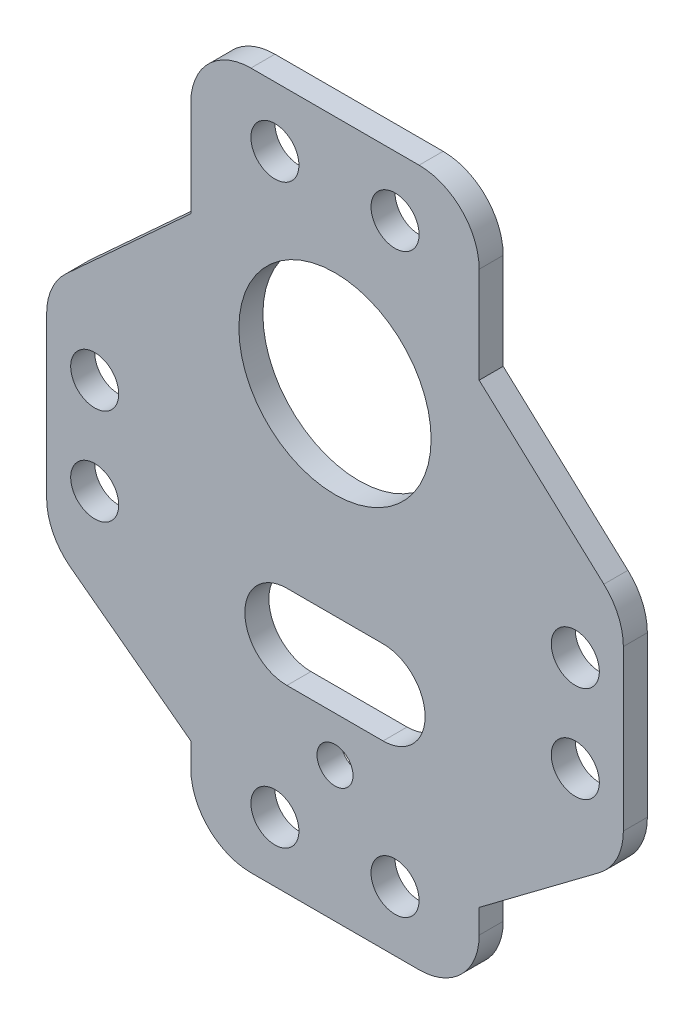
ISO-10303-21;
HEADER;
FILE_DESCRIPTION(('STEP AP214'),'2;1');
FILE_NAME('part.step','',(''),(''),'','','');
FILE_SCHEMA(('AUTOMOTIVE_DESIGN { 1 0 10303 214 1 1 1 1 }'));
ENDSEC;
DATA;
#1=APPLICATION_CONTEXT('core data for automotive mechanical design processes');
#2=APPLICATION_PROTOCOL_DEFINITION('international standard','automotive_design',2000,#1);
#3=PRODUCT_CONTEXT('',#1,'mechanical');
#4=PRODUCT('Part','Part','',(#3));
#5=PRODUCT_RELATED_PRODUCT_CATEGORY('part','',(#4));
#6=PRODUCT_DEFINITION_FORMATION('','',#4);
#7=PRODUCT_DEFINITION_CONTEXT('part definition',#1,'design');
#8=PRODUCT_DEFINITION('design','',#6,#7);
#9=PRODUCT_DEFINITION_SHAPE('','',#8);
#10=(LENGTH_UNIT() NAMED_UNIT(*) SI_UNIT(.MILLI.,.METRE.));
#11=(NAMED_UNIT(*) PLANE_ANGLE_UNIT() SI_UNIT($,.RADIAN.));
#12=(NAMED_UNIT(*) SI_UNIT($,.STERADIAN.) SOLID_ANGLE_UNIT());
#13=UNCERTAINTY_MEASURE_WITH_UNIT(LENGTH_MEASURE(1.E-05),#10,'distance_accuracy_value','');
#14=(GEOMETRIC_REPRESENTATION_CONTEXT(3) GLOBAL_UNCERTAINTY_ASSIGNED_CONTEXT((#13)) GLOBAL_UNIT_ASSIGNED_CONTEXT((#10,
#11,#12)) REPRESENTATION_CONTEXT('',''));
#15=CARTESIAN_POINT('',(0.,0.,0.));
#16=DIRECTION('',(0.,0.,1.));
#17=DIRECTION('',(1.,0.,0.));
#18=AXIS2_PLACEMENT_3D('',#15,#16,#17);
#19=CARTESIAN_POINT('',(0.,0.,2.));
#20=DIRECTION('',(0.,0.,-1.));
#21=DIRECTION('',(-1.,0.,0.));
#22=AXIS2_PLACEMENT_3D('',#19,#20,#21);
#23=PLANE('',#22);
#24=CARTESIAN_POINT('',(8.00000000000001,-65.75,2.));
#25=DIRECTION('',(0.,0.,-1.));
#26=DIRECTION('',(-1.,0.,0.));
#27=AXIS2_PLACEMENT_3D('',#24,#25,#26);
#28=CIRCLE('',#27,1.5);
#29=CARTESIAN_POINT('',(6.50000000000001,-65.75,2.));
#30=VERTEX_POINT('',#29);
#31=EDGE_CURVE('E331',#30,#30,#28,.T.);
#32=ORIENTED_EDGE('',*,*,#31,.T.);
#33=EDGE_LOOP('',(#32));
#34=FACE_BOUND('',#33,.T.);
#35=CARTESIAN_POINT('',(13.,-24.,2.));
#36=DIRECTION('',(0.,0.,-1.));
#37=DIRECTION('',(-1.,0.,0.));
#38=AXIS2_PLACEMENT_3D('',#35,#36,#37);
#39=CIRCLE('',#38,2.);
#40=CARTESIAN_POINT('',(11.,-24.,2.));
#41=VERTEX_POINT('',#40);
#42=EDGE_CURVE('E334',#41,#41,#39,.T.);
#43=ORIENTED_EDGE('',*,*,#42,.T.);
#44=EDGE_LOOP('',(#43));
#45=FACE_BOUND('',#44,.T.);
#46=CARTESIAN_POINT('',(-12.,-56.,2.));
#47=DIRECTION('',(0.,0.,-1.));
#48=DIRECTION('',(-1.,0.,0.));
#49=AXIS2_PLACEMENT_3D('',#46,#47,#48);
#50=CIRCLE('',#49,2.);
#51=CARTESIAN_POINT('',(-14.,-56.,2.));
#52=VERTEX_POINT('',#51);
#53=EDGE_CURVE('E337',#52,#52,#50,.T.);
#54=ORIENTED_EDGE('',*,*,#53,.T.);
#55=EDGE_LOOP('',(#54));
#56=FACE_BOUND('',#55,.T.);
#57=CARTESIAN_POINT('',(13.,-72.,2.));
#58=DIRECTION('',(0.,0.,-1.));
#59=DIRECTION('',(-1.,0.,0.));
#60=AXIS2_PLACEMENT_3D('',#57,#58,#59);
#61=CIRCLE('',#60,2.);
#62=CARTESIAN_POINT('',(11.,-72.,2.));
#63=VERTEX_POINT('',#62);
#64=EDGE_CURVE('E340',#63,#63,#61,.T.);
#65=ORIENTED_EDGE('',*,*,#64,.T.);
#66=EDGE_LOOP('',(#65));
#67=FACE_BOUND('',#66,.T.);
#68=CARTESIAN_POINT('',(8.00000000000001,-38.25,2.));
#69=DIRECTION('',(0.,0.,-1.));
#70=DIRECTION('',(-1.,0.,0.));
#71=AXIS2_PLACEMENT_3D('',#68,#69,#70);
#72=CIRCLE('',#71,8.);
#73=CARTESIAN_POINT('',(0.,-38.25,2.));
#74=VERTEX_POINT('',#73);
#75=EDGE_CURVE('E343',#74,#74,#72,.T.);
#76=ORIENTED_EDGE('',*,*,#75,.T.);
#77=EDGE_LOOP('',(#76));
#78=FACE_BOUND('',#77,.T.);
#79=CARTESIAN_POINT('',(27.,-58.5,2.));
#80=DIRECTION('',(0.,0.,-1.));
#81=DIRECTION('',(-1.,0.,0.));
#82=AXIS2_PLACEMENT_3D('',#79,#80,#81);
#83=CIRCLE('',#82,5.);
#84=CARTESIAN_POINT('',(32.,-58.5,2.));
#85=VERTEX_POINT('',#84);
#86=CARTESIAN_POINT('',(30.,-62.5,2.));
#87=VERTEX_POINT('',#86);
#88=EDGE_CURVE('E203',#85,#87,#83,.T.);
#89=ORIENTED_EDGE('',*,*,#88,.F.);
#90=DIRECTION('',(0.,1.,0.));
#91=VECTOR('',#90,1.);
#92=CARTESIAN_POINT('',(32.,-43.,2.));
#93=LINE('',#92,#91);
#94=CARTESIAN_POINT('',(32.,-45.1995085817082,2.));
#95=VERTEX_POINT('',#94);
#96=EDGE_CURVE('E200',#95,#85,#93,.F.);
#97=ORIENTED_EDGE('',*,*,#96,.F.);
#98=CARTESIAN_POINT('',(27.,-45.1995085817082,2.));
#99=DIRECTION('',(0.,0.,1.));
#100=DIRECTION('',(1.,0.,0.));
#101=AXIS2_PLACEMENT_3D('',#98,#99,#100);
#102=CIRCLE('',#101,5.);
#103=CARTESIAN_POINT('',(30.3786231425867,-41.5137378807045,2.));
#104=VERTEX_POINT('',#103);
#105=EDGE_CURVE('E196',#104,#95,#102,.F.);
#106=ORIENTED_EDGE('',*,*,#105,.F.);
#107=DIRECTION('',(0.737154140200742,-0.675724628517346,0.));
#108=VECTOR('',#107,1.);
#109=CARTESIAN_POINT('',(32.,-43.,2.));
#110=LINE('',#109,#108);
#111=CARTESIAN_POINT('',(20.,-32.,2.));
#112=VERTEX_POINT('',#111);
#113=EDGE_CURVE('E193',#104,#112,#110,.F.);
#114=ORIENTED_EDGE('',*,*,#113,.T.);
#115=DIRECTION('',(0.,-1.,0.));
#116=VECTOR('',#115,1.);
#117=CARTESIAN_POINT('',(20.,-32.,2.));
#118=LINE('',#117,#116);
#119=CARTESIAN_POINT('',(20.,-24.,2.));
#120=VERTEX_POINT('',#119);
#121=EDGE_CURVE('E205',#112,#120,#118,.F.);
#122=ORIENTED_EDGE('',*,*,#121,.T.);
#123=CARTESIAN_POINT('',(15.,-24.,2.));
#124=DIRECTION('',(0.,0.,-1.));
#125=DIRECTION('',(-1.,0.,0.));
#126=AXIS2_PLACEMENT_3D('',#123,#124,#125);
#127=CIRCLE('',#126,5.);
#128=CARTESIAN_POINT('',(15.,-19.,2.));
#129=VERTEX_POINT('',#128);
#130=EDGE_CURVE('E349',#129,#120,#127,.T.);
#131=ORIENTED_EDGE('',*,*,#130,.F.);
#132=DIRECTION('',(1.,0.,0.));
#133=VECTOR('',#132,1.);
#134=CARTESIAN_POINT('',(20.,-19.,2.));
#135=LINE('',#134,#133);
#136=CARTESIAN_POINT('',(0.999999999999998,-19.,2.));
#137=VERTEX_POINT('',#136);
#138=EDGE_CURVE('E211',#129,#137,#135,.F.);
#139=ORIENTED_EDGE('',*,*,#138,.T.);
#140=CARTESIAN_POINT('',(0.999999999999999,-24.,2.));
#141=DIRECTION('',(0.,0.,1.));
#142=DIRECTION('',(1.,0.,0.));
#143=AXIS2_PLACEMENT_3D('',#140,#141,#142);
#144=CIRCLE('',#143,5.);
#145=CARTESIAN_POINT('',(-4.,-24.,2.));
#146=VERTEX_POINT('',#145);
#147=EDGE_CURVE('E352',#146,#137,#144,.F.);
#148=ORIENTED_EDGE('',*,*,#147,.F.);
#149=DIRECTION('',(0.,-1.,0.));
#150=VECTOR('',#149,1.);
#151=CARTESIAN_POINT('',(-4.00000000000001,-32.,2.));
#152=LINE('',#151,#150);
#153=CARTESIAN_POINT('',(-4.,-32.,2.));
#154=VERTEX_POINT('',#153);
#155=EDGE_CURVE('E215',#154,#146,#152,.F.);
#156=ORIENTED_EDGE('',*,*,#155,.F.);
#157=DIRECTION('',(-0.737154140200741,-0.675724628517346,0.));
#158=VECTOR('',#157,1.);
#159=CARTESIAN_POINT('',(-16.,-43.,2.));
#160=LINE('',#159,#158);
#161=CARTESIAN_POINT('',(-14.3786231425867,-41.5137378807045,2.));
#162=VERTEX_POINT('',#161);
#163=EDGE_CURVE('E219',#162,#154,#160,.F.);
#164=ORIENTED_EDGE('',*,*,#163,.F.);
#165=CARTESIAN_POINT('',(-11.,-45.1995085817082,2.));
#166=DIRECTION('',(0.,0.,1.));
#167=DIRECTION('',(1.,0.,0.));
#168=AXIS2_PLACEMENT_3D('',#165,#166,#167);
#169=CIRCLE('',#168,5.);
#170=CARTESIAN_POINT('',(-16.,-45.1995085817082,2.));
#171=VERTEX_POINT('',#170);
#172=EDGE_CURVE('E355',#171,#162,#169,.F.);
#173=ORIENTED_EDGE('',*,*,#172,.F.);
#174=DIRECTION('',(0.,1.,0.));
#175=VECTOR('',#174,1.);
#176=CARTESIAN_POINT('',(-16.,-43.,2.));
#177=LINE('',#176,#175);
#178=CARTESIAN_POINT('',(-16.,-58.5,2.));
#179=VERTEX_POINT('',#178);
#180=EDGE_CURVE('E227',#171,#179,#177,.F.);
#181=ORIENTED_EDGE('',*,*,#180,.T.);
#182=CARTESIAN_POINT('',(-11.,-58.5,2.));
#183=DIRECTION('',(0.,0.,-1.));
#184=DIRECTION('',(-1.,0.,0.));
#185=AXIS2_PLACEMENT_3D('',#182,#183,#184);
#186=CIRCLE('',#185,5.);
#187=CARTESIAN_POINT('',(-14.,-62.5,2.));
#188=VERTEX_POINT('',#187);
#189=EDGE_CURVE('E234',#188,#179,#186,.T.);
#190=ORIENTED_EDGE('',*,*,#189,.F.);
#191=DIRECTION('',(-0.8,0.6,0.));
#192=VECTOR('',#191,1.);
#193=CARTESIAN_POINT('',(-16.,-61.,2.));
#194=LINE('',#193,#192);
#195=CARTESIAN_POINT('',(-4.,-70.,2.));
#196=VERTEX_POINT('',#195);
#197=EDGE_CURVE('E231',#188,#196,#194,.F.);
#198=ORIENTED_EDGE('',*,*,#197,.T.);
#199=DIRECTION('',(0.,1.,0.));
#200=VECTOR('',#199,1.);
#201=CARTESIAN_POINT('',(-4.,-70.,2.));
#202=LINE('',#201,#200);
#203=CARTESIAN_POINT('',(-4.,-72.,2.));
#204=VERTEX_POINT('',#203);
#205=EDGE_CURVE('E238',#196,#204,#202,.F.);
#206=ORIENTED_EDGE('',*,*,#205,.T.);
#207=CARTESIAN_POINT('',(1.,-72.,2.));
#208=DIRECTION('',(0.,0.,1.));
#209=DIRECTION('',(1.,0.,0.));
#210=AXIS2_PLACEMENT_3D('',#207,#208,#209);
#211=CIRCLE('',#210,5.);
#212=CARTESIAN_POINT('',(1.,-77.,2.));
#213=VERTEX_POINT('',#212);
#214=EDGE_CURVE('E247',#213,#204,#211,.F.);
#215=ORIENTED_EDGE('',*,*,#214,.F.);
#216=DIRECTION('',(1.,0.,0.));
#217=VECTOR('',#216,1.);
#218=CARTESIAN_POINT('',(20.,-77.,2.));
#219=LINE('',#218,#217);
#220=CARTESIAN_POINT('',(15.,-77.,2.));
#221=VERTEX_POINT('',#220);
#222=EDGE_CURVE('E244',#221,#213,#219,.F.);
#223=ORIENTED_EDGE('',*,*,#222,.F.);
#224=CARTESIAN_POINT('',(15.,-72.,2.));
#225=DIRECTION('',(0.,0.,-1.));
#226=DIRECTION('',(-1.,0.,0.));
#227=AXIS2_PLACEMENT_3D('',#224,#225,#226);
#228=CIRCLE('',#227,5.);
#229=CARTESIAN_POINT('',(20.,-72.,2.));
#230=VERTEX_POINT('',#229);
#231=EDGE_CURVE('E362',#230,#221,#228,.T.);
#232=ORIENTED_EDGE('',*,*,#231,.F.);
#233=DIRECTION('',(0.,1.,0.));
#234=VECTOR('',#233,1.);
#235=CARTESIAN_POINT('',(20.,-70.,2.));
#236=LINE('',#235,#234);
#237=CARTESIAN_POINT('',(20.,-70.,2.));
#238=VERTEX_POINT('',#237);
#239=EDGE_CURVE('E249',#238,#230,#236,.F.);
#240=ORIENTED_EDGE('',*,*,#239,.F.);
#241=DIRECTION('',(0.800000000000001,0.599999999999999,0.));
#242=VECTOR('',#241,1.);
#243=CARTESIAN_POINT('',(32.,-61.,2.));
#244=LINE('',#243,#242);
#245=EDGE_CURVE('E253',#87,#238,#244,.F.);
#246=ORIENTED_EDGE('',*,*,#245,.F.);
#247=EDGE_LOOP('',(#89,#97,#106,#114,#122,#131,#139,#148,#156,#164,#173,#181,#190,#198,#206,
#215,#223,#232,#240,#246));
#248=FACE_BOUND('',#247,.T.);
#249=CARTESIAN_POINT('',(4.,-58.5,2.));
#250=DIRECTION('',(0.,0.,-1.));
#251=DIRECTION('',(-1.,0.,0.));
#252=AXIS2_PLACEMENT_3D('',#249,#250,#251);
#253=CIRCLE('',#252,3.5);
#254=CARTESIAN_POINT('',(4.,-62.,2.));
#255=VERTEX_POINT('',#254);
#256=CARTESIAN_POINT('',(4.,-55.,2.));
#257=VERTEX_POINT('',#256);
#258=EDGE_CURVE('E165',#255,#257,#253,.T.);
#259=ORIENTED_EDGE('',*,*,#258,.T.);
#260=DIRECTION('',(1.,0.,0.));
#261=VECTOR('',#260,1.);
#262=CARTESIAN_POINT('',(4.,-55.,2.));
#263=LINE('',#262,#261);
#264=CARTESIAN_POINT('',(12.,-55.,2.));
#265=VERTEX_POINT('',#264);
#266=EDGE_CURVE('E261',#257,#265,#263,.T.);
#267=ORIENTED_EDGE('',*,*,#266,.T.);
#268=CARTESIAN_POINT('',(12.,-58.5,2.));
#269=DIRECTION('',(0.,0.,-1.));
#270=DIRECTION('',(-1.,0.,0.));
#271=AXIS2_PLACEMENT_3D('',#268,#269,#270);
#272=CIRCLE('',#271,3.5);
#273=CARTESIAN_POINT('',(12.,-62.,2.));
#274=VERTEX_POINT('',#273);
#275=EDGE_CURVE('E181',#265,#274,#272,.T.);
#276=ORIENTED_EDGE('',*,*,#275,.T.);
#277=DIRECTION('',(1.,0.,0.));
#278=VECTOR('',#277,1.);
#279=CARTESIAN_POINT('',(4.,-62.,2.));
#280=LINE('',#279,#278);
#281=EDGE_CURVE('E178',#255,#274,#280,.T.);
#282=ORIENTED_EDGE('',*,*,#281,.F.);
#283=EDGE_LOOP('',(#259,#267,#276,#282));
#284=FACE_BOUND('',#283,.T.);
#285=CARTESIAN_POINT('',(28.,-48.,2.));
#286=DIRECTION('',(0.,0.,-1.));
#287=DIRECTION('',(-1.,0.,0.));
#288=AXIS2_PLACEMENT_3D('',#285,#286,#287);
#289=CIRCLE('',#288,2.);
#290=CARTESIAN_POINT('',(26.,-48.,2.));
#291=VERTEX_POINT('',#290);
#292=EDGE_CURVE('E175',#291,#291,#289,.T.);
#293=ORIENTED_EDGE('',*,*,#292,.T.);
#294=EDGE_LOOP('',(#293));
#295=FACE_BOUND('',#294,.T.);
#296=CARTESIAN_POINT('',(28.,-56.,2.));
#297=DIRECTION('',(0.,0.,-1.));
#298=DIRECTION('',(-1.,0.,0.));
#299=AXIS2_PLACEMENT_3D('',#296,#297,#298);
#300=CIRCLE('',#299,2.);
#301=CARTESIAN_POINT('',(26.,-56.,2.));
#302=VERTEX_POINT('',#301);
#303=EDGE_CURVE('E370',#302,#302,#300,.T.);
#304=ORIENTED_EDGE('',*,*,#303,.T.);
#305=EDGE_LOOP('',(#304));
#306=FACE_BOUND('',#305,.T.);
#307=CARTESIAN_POINT('',(3.,-72.,2.));
#308=DIRECTION('',(0.,0.,-1.));
#309=DIRECTION('',(-1.,0.,0.));
#310=AXIS2_PLACEMENT_3D('',#307,#308,#309);
#311=CIRCLE('',#310,2.);
#312=CARTESIAN_POINT('',(0.999999999999997,-72.,2.));
#313=VERTEX_POINT('',#312);
#314=EDGE_CURVE('E373',#313,#313,#311,.T.);
#315=ORIENTED_EDGE('',*,*,#314,.T.);
#316=EDGE_LOOP('',(#315));
#317=FACE_BOUND('',#316,.T.);
#318=CARTESIAN_POINT('',(-12.,-48.,2.));
#319=DIRECTION('',(0.,0.,-1.));
#320=DIRECTION('',(-1.,0.,0.));
#321=AXIS2_PLACEMENT_3D('',#318,#319,#320);
#322=CIRCLE('',#321,2.);
#323=CARTESIAN_POINT('',(-14.,-48.,2.));
#324=VERTEX_POINT('',#323);
#325=EDGE_CURVE('E375',#324,#324,#322,.T.);
#326=ORIENTED_EDGE('',*,*,#325,.T.);
#327=EDGE_LOOP('',(#326));
#328=FACE_BOUND('',#327,.T.);
#329=CARTESIAN_POINT('',(3.,-24.,2.));
#330=DIRECTION('',(0.,0.,-1.));
#331=DIRECTION('',(-1.,0.,0.));
#332=AXIS2_PLACEMENT_3D('',#329,#330,#331);
#333=CIRCLE('',#332,2.);
#334=CARTESIAN_POINT('',(0.999999999999996,-24.,2.));
#335=VERTEX_POINT('',#334);
#336=EDGE_CURVE('E20',#335,#335,#333,.T.);
#337=ORIENTED_EDGE('',*,*,#336,.T.);
#338=EDGE_LOOP('',(#337));
#339=FACE_BOUND('',#338,.T.);
#340=ADVANCED_FACE('F17',(#34,#45,#56,#67,#78,#248,#284,#295,#306,#317,#328,#339),#23,.F.);
#341=CARTESIAN_POINT('',(3.,-24.,2.));
#342=DIRECTION('',(0.,0.,-1.));
#343=DIRECTION('',(-1.,0.,0.));
#344=AXIS2_PLACEMENT_3D('',#341,#342,#343);
#345=CYLINDRICAL_SURFACE('',#344,2.);
#346=ORIENTED_EDGE('',*,*,#336,.F.);
#347=EDGE_LOOP('',(#346));
#348=FACE_BOUND('',#347,.T.);
#349=CARTESIAN_POINT('',(3.,-24.,0.));
#350=DIRECTION('',(0.,0.,-1.));
#351=DIRECTION('',(-1.,0.,0.));
#352=AXIS2_PLACEMENT_3D('',#349,#350,#351);
#353=CIRCLE('',#352,2.);
#354=CARTESIAN_POINT('',(0.999999999999996,-24.,0.));
#355=VERTEX_POINT('',#354);
#356=EDGE_CURVE('E328',#355,#355,#353,.F.);
#357=ORIENTED_EDGE('',*,*,#356,.F.);
#358=EDGE_LOOP('',(#357));
#359=FACE_BOUND('',#358,.T.);
#360=ADVANCED_FACE('F383',(#348,#359),#345,.F.);
#361=CARTESIAN_POINT('',(-12.,-48.,2.));
#362=DIRECTION('',(0.,0.,-1.));
#363=DIRECTION('',(-1.,0.,0.));
#364=AXIS2_PLACEMENT_3D('',#361,#362,#363);
#365=CYLINDRICAL_SURFACE('',#364,2.);
#366=ORIENTED_EDGE('',*,*,#325,.F.);
#367=EDGE_LOOP('',(#366));
#368=FACE_BOUND('',#367,.T.);
#369=CARTESIAN_POINT('',(-12.,-48.,0.));
#370=DIRECTION('',(0.,0.,-1.));
#371=DIRECTION('',(-1.,0.,0.));
#372=AXIS2_PLACEMENT_3D('',#369,#370,#371);
#373=CIRCLE('',#372,2.);
#374=CARTESIAN_POINT('',(-14.,-48.,0.));
#375=VERTEX_POINT('',#374);
#376=EDGE_CURVE('E325',#375,#375,#373,.F.);
#377=ORIENTED_EDGE('',*,*,#376,.F.);
#378=EDGE_LOOP('',(#377));
#379=FACE_BOUND('',#378,.T.);
#380=ADVANCED_FACE('F386',(#368,#379),#365,.F.);
#381=CARTESIAN_POINT('',(3.,-72.,2.));
#382=DIRECTION('',(0.,0.,-1.));
#383=DIRECTION('',(-1.,0.,0.));
#384=AXIS2_PLACEMENT_3D('',#381,#382,#383);
#385=CYLINDRICAL_SURFACE('',#384,2.);
#386=ORIENTED_EDGE('',*,*,#314,.F.);
#387=EDGE_LOOP('',(#386));
#388=FACE_BOUND('',#387,.T.);
#389=CARTESIAN_POINT('',(3.,-72.,0.));
#390=DIRECTION('',(0.,0.,-1.));
#391=DIRECTION('',(-1.,0.,0.));
#392=AXIS2_PLACEMENT_3D('',#389,#390,#391);
#393=CIRCLE('',#392,2.);
#394=CARTESIAN_POINT('',(0.999999999999997,-72.,0.));
#395=VERTEX_POINT('',#394);
#396=EDGE_CURVE('E322',#395,#395,#393,.F.);
#397=ORIENTED_EDGE('',*,*,#396,.F.);
#398=EDGE_LOOP('',(#397));
#399=FACE_BOUND('',#398,.T.);
#400=ADVANCED_FACE('F516',(#388,#399),#385,.F.);
#401=CARTESIAN_POINT('',(28.,-56.,2.));
#402=DIRECTION('',(0.,0.,-1.));
#403=DIRECTION('',(-1.,0.,0.));
#404=AXIS2_PLACEMENT_3D('',#401,#402,#403);
#405=CYLINDRICAL_SURFACE('',#404,2.);
#406=CARTESIAN_POINT('',(28.,-56.,0.));
#407=DIRECTION('',(0.,0.,-1.));
#408=DIRECTION('',(-1.,0.,0.));
#409=AXIS2_PLACEMENT_3D('',#406,#407,#408);
#410=CIRCLE('',#409,2.);
#411=CARTESIAN_POINT('',(26.,-56.,0.));
#412=VERTEX_POINT('',#411);
#413=EDGE_CURVE('E319',#412,#412,#410,.F.);
#414=ORIENTED_EDGE('',*,*,#413,.F.);
#415=EDGE_LOOP('',(#414));
#416=FACE_BOUND('',#415,.T.);
#417=ORIENTED_EDGE('',*,*,#303,.F.);
#418=EDGE_LOOP('',(#417));
#419=FACE_BOUND('',#418,.T.);
#420=ADVANCED_FACE('F512',(#416,#419),#405,.F.);
#421=CARTESIAN_POINT('',(28.,-48.,2.));
#422=DIRECTION('',(0.,0.,-1.));
#423=DIRECTION('',(-1.,0.,0.));
#424=AXIS2_PLACEMENT_3D('',#421,#422,#423);
#425=CYLINDRICAL_SURFACE('',#424,2.);
#426=CARTESIAN_POINT('',(28.,-48.,0.));
#427=DIRECTION('',(0.,0.,-1.));
#428=DIRECTION('',(-1.,0.,0.));
#429=AXIS2_PLACEMENT_3D('',#426,#427,#428);
#430=CIRCLE('',#429,2.);
#431=CARTESIAN_POINT('',(26.,-48.,0.));
#432=VERTEX_POINT('',#431);
#433=EDGE_CURVE('E316',#432,#432,#430,.F.);
#434=ORIENTED_EDGE('',*,*,#433,.F.);
#435=EDGE_LOOP('',(#434));
#436=FACE_BOUND('',#435,.T.);
#437=ORIENTED_EDGE('',*,*,#292,.F.);
#438=EDGE_LOOP('',(#437));
#439=FACE_BOUND('',#438,.T.);
#440=ADVANCED_FACE('F509',(#436,#439),#425,.F.);
#441=CARTESIAN_POINT('',(4.,-58.5,2.));
#442=DIRECTION('',(0.,0.,-1.));
#443=DIRECTION('',(-1.,0.,0.));
#444=AXIS2_PLACEMENT_3D('',#441,#442,#443);
#445=CYLINDRICAL_SURFACE('',#444,3.5);
#446=ORIENTED_EDGE('',*,*,#258,.F.);
#447=DIRECTION('',(0.,0.,1.));
#448=VECTOR('',#447,1.);
#449=CARTESIAN_POINT('',(4.,-62.,2.));
#450=LINE('',#449,#448);
#451=CARTESIAN_POINT('',(4.,-62.,0.));
#452=VERTEX_POINT('',#451);
#453=EDGE_CURVE('E169',#452,#255,#450,.T.);
#454=ORIENTED_EDGE('',*,*,#453,.F.);
#455=CARTESIAN_POINT('',(4.,-58.5,0.));
#456=DIRECTION('',(0.,0.,-1.));
#457=DIRECTION('',(-1.,0.,0.));
#458=AXIS2_PLACEMENT_3D('',#455,#456,#457);
#459=CIRCLE('',#458,3.5);
#460=CARTESIAN_POINT('',(4.,-55.,0.));
#461=VERTEX_POINT('',#460);
#462=EDGE_CURVE('E314',#461,#452,#459,.F.);
#463=ORIENTED_EDGE('',*,*,#462,.F.);
#464=DIRECTION('',(0.,0.,1.));
#465=VECTOR('',#464,1.);
#466=CARTESIAN_POINT('',(4.,-55.,2.));
#467=LINE('',#466,#465);
#468=EDGE_CURVE('E172',#461,#257,#467,.T.);
#469=ORIENTED_EDGE('',*,*,#468,.T.);
#470=EDGE_LOOP('',(#446,#454,#463,#469));
#471=FACE_BOUND('',#470,.T.);
#472=ADVANCED_FACE('F167',(#471),#445,.F.);
#473=CARTESIAN_POINT('',(4.,-62.,2.));
#474=DIRECTION('',(0.,1.,0.));
#475=DIRECTION('',(0.,0.,1.));
#476=AXIS2_PLACEMENT_3D('',#473,#474,#475);
#477=PLANE('',#476);
#478=ORIENTED_EDGE('',*,*,#281,.T.);
#479=DIRECTION('',(0.,0.,-1.));
#480=VECTOR('',#479,1.);
#481=CARTESIAN_POINT('',(12.,-62.,2.));
#482=LINE('',#481,#480);
#483=CARTESIAN_POINT('',(12.,-62.,0.));
#484=VERTEX_POINT('',#483);
#485=EDGE_CURVE('E191',#274,#484,#482,.T.);
#486=ORIENTED_EDGE('',*,*,#485,.T.);
#487=DIRECTION('',(-1.,0.,0.));
#488=VECTOR('',#487,1.);
#489=CARTESIAN_POINT('',(0.,-62.,0.));
#490=LINE('',#489,#488);
#491=EDGE_CURVE('E187',#452,#484,#490,.F.);
#492=ORIENTED_EDGE('',*,*,#491,.F.);
#493=ORIENTED_EDGE('',*,*,#453,.T.);
#494=EDGE_LOOP('',(#478,#486,#492,#493));
#495=FACE_BOUND('',#494,.T.);
#496=ADVANCED_FACE('F185',(#495),#477,.T.);
#497=CARTESIAN_POINT('',(12.,-58.5,2.));
#498=DIRECTION('',(0.,0.,-1.));
#499=DIRECTION('',(-1.,0.,0.));
#500=AXIS2_PLACEMENT_3D('',#497,#498,#499);
#501=CYLINDRICAL_SURFACE('',#500,3.5);
#502=ORIENTED_EDGE('',*,*,#485,.F.);
#503=ORIENTED_EDGE('',*,*,#275,.F.);
#504=DIRECTION('',(0.,0.,1.));
#505=VECTOR('',#504,1.);
#506=CARTESIAN_POINT('',(12.,-55.,2.));
#507=LINE('',#506,#505);
#508=CARTESIAN_POINT('',(12.,-55.,0.));
#509=VERTEX_POINT('',#508);
#510=EDGE_CURVE('E204',#265,#509,#507,.F.);
#511=ORIENTED_EDGE('',*,*,#510,.T.);
#512=CARTESIAN_POINT('',(12.,-58.5,0.));
#513=DIRECTION('',(0.,0.,-1.));
#514=DIRECTION('',(-1.,0.,0.));
#515=AXIS2_PLACEMENT_3D('',#512,#513,#514);
#516=CIRCLE('',#515,3.5);
#517=EDGE_CURVE('E310',#484,#509,#516,.F.);
#518=ORIENTED_EDGE('',*,*,#517,.F.);
#519=EDGE_LOOP('',(#502,#503,#511,#518));
#520=FACE_BOUND('',#519,.T.);
#521=ADVANCED_FACE('F500',(#520),#501,.F.);
#522=CARTESIAN_POINT('',(4.,-55.,2.));
#523=DIRECTION('',(0.,1.,0.));
#524=DIRECTION('',(0.,0.,1.));
#525=AXIS2_PLACEMENT_3D('',#522,#523,#524);
#526=PLANE('',#525);
#527=ORIENTED_EDGE('',*,*,#510,.F.);
#528=ORIENTED_EDGE('',*,*,#266,.F.);
#529=ORIENTED_EDGE('',*,*,#468,.F.);
#530=DIRECTION('',(-1.,0.,0.));
#531=VECTOR('',#530,1.);
#532=CARTESIAN_POINT('',(0.,-55.,0.));
#533=LINE('',#532,#531);
#534=EDGE_CURVE('E313',#509,#461,#533,.T.);
#535=ORIENTED_EDGE('',*,*,#534,.F.);
#536=EDGE_LOOP('',(#527,#528,#529,#535));
#537=FACE_BOUND('',#536,.T.);
#538=ADVANCED_FACE('F496',(#537),#526,.F.);
#539=CARTESIAN_POINT('',(32.,-43.,2.));
#540=DIRECTION('',(1.,0.,0.));
#541=DIRECTION('',(0.,0.,-1.));
#542=AXIS2_PLACEMENT_3D('',#539,#540,#541);
#543=PLANE('',#542);
#544=DIRECTION('',(0.,1.,0.));
#545=VECTOR('',#544,1.);
#546=CARTESIAN_POINT('',(32.,0.,0.));
#547=LINE('',#546,#545);
#548=CARTESIAN_POINT('',(32.,-45.1995085817082,0.));
#549=VERTEX_POINT('',#548);
#550=CARTESIAN_POINT('',(32.,-58.5,0.));
#551=VERTEX_POINT('',#550);
#552=EDGE_CURVE('E309',#549,#551,#547,.F.);
#553=ORIENTED_EDGE('',*,*,#552,.F.);
#554=DIRECTION('',(0.,0.,1.));
#555=VECTOR('',#554,1.);
#556=CARTESIAN_POINT('',(32.,-45.1995085817082,2.));
#557=LINE('',#556,#555);
#558=EDGE_CURVE('E348',#95,#549,#557,.F.);
#559=ORIENTED_EDGE('',*,*,#558,.F.);
#560=ORIENTED_EDGE('',*,*,#96,.T.);
#561=DIRECTION('',(0.,0.,-1.));
#562=VECTOR('',#561,1.);
#563=CARTESIAN_POINT('',(32.,-58.5,2.));
#564=LINE('',#563,#562);
#565=EDGE_CURVE('E366',#551,#85,#564,.F.);
#566=ORIENTED_EDGE('',*,*,#565,.F.);
#567=EDGE_LOOP('',(#553,#559,#560,#566));
#568=FACE_BOUND('',#567,.T.);
#569=ADVANCED_FACE('F492',(#568),#543,.T.);
#570=CARTESIAN_POINT('',(27.,-58.5,2.));
#571=DIRECTION('',(0.,0.,-1.));
#572=DIRECTION('',(-1.,0.,0.));
#573=AXIS2_PLACEMENT_3D('',#570,#571,#572);
#574=CYLINDRICAL_SURFACE('',#573,5.);
#575=CARTESIAN_POINT('',(27.,-58.5,0.));
#576=DIRECTION('',(0.,0.,-1.));
#577=DIRECTION('',(-1.,0.,0.));
#578=AXIS2_PLACEMENT_3D('',#575,#576,#577);
#579=CIRCLE('',#578,5.);
#580=CARTESIAN_POINT('',(30.,-62.5,0.));
#581=VERTEX_POINT('',#580);
#582=EDGE_CURVE('E305',#551,#581,#579,.T.);
#583=ORIENTED_EDGE('',*,*,#582,.F.);
#584=ORIENTED_EDGE('',*,*,#565,.T.);
#585=ORIENTED_EDGE('',*,*,#88,.T.);
#586=DIRECTION('',(0.,0.,1.));
#587=VECTOR('',#586,1.);
#588=CARTESIAN_POINT('',(30.,-62.5,2.));
#589=LINE('',#588,#587);
#590=EDGE_CURVE('E258',#581,#87,#589,.T.);
#591=ORIENTED_EDGE('',*,*,#590,.F.);
#592=EDGE_LOOP('',(#583,#584,#585,#591));
#593=FACE_BOUND('',#592,.T.);
#594=ADVANCED_FACE('F488',(#593),#574,.T.);
#595=CARTESIAN_POINT('',(32.,-61.,2.));
#596=DIRECTION('',(0.599999999999999,-0.800000000000001,0.));
#597=DIRECTION('',(0.800000000000001,0.599999999999999,0.));
#598=AXIS2_PLACEMENT_3D('',#595,#596,#597);
#599=PLANE('',#598);
#600=ORIENTED_EDGE('',*,*,#245,.T.);
#601=DIRECTION('',(0.,0.,-1.));
#602=VECTOR('',#601,1.);
#603=CARTESIAN_POINT('',(20.,-70.,2.));
#604=LINE('',#603,#602);
#605=CARTESIAN_POINT('',(20.,-70.,0.));
#606=VERTEX_POINT('',#605);
#607=EDGE_CURVE('E252',#606,#238,#604,.F.);
#608=ORIENTED_EDGE('',*,*,#607,.F.);
#609=DIRECTION('',(-0.8,-0.599999999999999,0.));
#610=VECTOR('',#609,1.);
#611=CARTESIAN_POINT('',(30.,-62.5,0.));
#612=LINE('',#611,#610);
#613=EDGE_CURVE('E308',#581,#606,#612,.T.);
#614=ORIENTED_EDGE('',*,*,#613,.F.);
#615=ORIENTED_EDGE('',*,*,#590,.T.);
#616=EDGE_LOOP('',(#600,#608,#614,#615));
#617=FACE_BOUND('',#616,.T.);
#618=ADVANCED_FACE('F484',(#617),#599,.T.);
#619=CARTESIAN_POINT('',(20.,-70.,2.));
#620=DIRECTION('',(1.,0.,0.));
#621=DIRECTION('',(0.,0.,-1.));
#622=AXIS2_PLACEMENT_3D('',#619,#620,#621);
#623=PLANE('',#622);
#624=DIRECTION('',(0.,1.,0.));
#625=VECTOR('',#624,1.);
#626=CARTESIAN_POINT('',(20.,0.,0.));
#627=LINE('',#626,#625);
#628=CARTESIAN_POINT('',(20.,-72.,0.));
#629=VERTEX_POINT('',#628);
#630=EDGE_CURVE('E304',#606,#629,#627,.F.);
#631=ORIENTED_EDGE('',*,*,#630,.F.);
#632=ORIENTED_EDGE('',*,*,#607,.T.);
#633=ORIENTED_EDGE('',*,*,#239,.T.);
#634=DIRECTION('',(0.,0.,-1.));
#635=VECTOR('',#634,1.);
#636=CARTESIAN_POINT('',(20.,-72.,2.));
#637=LINE('',#636,#635);
#638=EDGE_CURVE('E364',#629,#230,#637,.F.);
#639=ORIENTED_EDGE('',*,*,#638,.F.);
#640=EDGE_LOOP('',(#631,#632,#633,#639));
#641=FACE_BOUND('',#640,.T.);
#642=ADVANCED_FACE('F480',(#641),#623,.T.);
#643=CARTESIAN_POINT('',(15.,-72.,2.));
#644=DIRECTION('',(0.,0.,-1.));
#645=DIRECTION('',(-1.,0.,0.));
#646=AXIS2_PLACEMENT_3D('',#643,#644,#645);
#647=CYLINDRICAL_SURFACE('',#646,5.);
#648=CARTESIAN_POINT('',(15.,-72.,0.));
#649=DIRECTION('',(0.,0.,-1.));
#650=DIRECTION('',(-1.,0.,0.));
#651=AXIS2_PLACEMENT_3D('',#648,#649,#650);
#652=CIRCLE('',#651,5.);
#653=CARTESIAN_POINT('',(15.,-77.,0.));
#654=VERTEX_POINT('',#653);
#655=EDGE_CURVE('E301',#629,#654,#652,.T.);
#656=ORIENTED_EDGE('',*,*,#655,.F.);
#657=ORIENTED_EDGE('',*,*,#638,.T.);
#658=ORIENTED_EDGE('',*,*,#231,.T.);
#659=DIRECTION('',(0.,0.,-1.));
#660=VECTOR('',#659,1.);
#661=CARTESIAN_POINT('',(15.,-77.,2.));
#662=LINE('',#661,#660);
#663=EDGE_CURVE('E248',#654,#221,#662,.F.);
#664=ORIENTED_EDGE('',*,*,#663,.F.);
#665=EDGE_LOOP('',(#656,#657,#658,#664));
#666=FACE_BOUND('',#665,.T.);
#667=ADVANCED_FACE('F476',(#666),#647,.T.);
#668=CARTESIAN_POINT('',(20.,-77.,2.));
#669=DIRECTION('',(0.,-1.,0.));
#670=DIRECTION('',(0.,0.,-1.));
#671=AXIS2_PLACEMENT_3D('',#668,#669,#670);
#672=PLANE('',#671);
#673=ORIENTED_EDGE('',*,*,#222,.T.);
#674=DIRECTION('',(0.,0.,1.));
#675=VECTOR('',#674,1.);
#676=CARTESIAN_POINT('',(1.,-77.,2.));
#677=LINE('',#676,#675);
#678=CARTESIAN_POINT('',(1.,-77.,0.));
#679=VERTEX_POINT('',#678);
#680=EDGE_CURVE('E241',#679,#213,#677,.T.);
#681=ORIENTED_EDGE('',*,*,#680,.F.);
#682=DIRECTION('',(-1.,0.,0.));
#683=VECTOR('',#682,1.);
#684=CARTESIAN_POINT('',(0.,-77.,0.));
#685=LINE('',#684,#683);
#686=EDGE_CURVE('E300',#654,#679,#685,.T.);
#687=ORIENTED_EDGE('',*,*,#686,.F.);
#688=ORIENTED_EDGE('',*,*,#663,.T.);
#689=EDGE_LOOP('',(#673,#681,#687,#688));
#690=FACE_BOUND('',#689,.T.);
#691=ADVANCED_FACE('F472',(#690),#672,.T.);
#692=CARTESIAN_POINT('',(1.,-72.,2.));
#693=DIRECTION('',(0.,0.,1.));
#694=DIRECTION('',(1.,0.,0.));
#695=AXIS2_PLACEMENT_3D('',#692,#693,#694);
#696=CYLINDRICAL_SURFACE('',#695,5.);
#697=CARTESIAN_POINT('',(1.,-72.,0.));
#698=DIRECTION('',(0.,0.,1.));
#699=DIRECTION('',(1.,0.,0.));
#700=AXIS2_PLACEMENT_3D('',#697,#698,#699);
#701=CIRCLE('',#700,5.);
#702=CARTESIAN_POINT('',(-4.,-72.,0.));
#703=VERTEX_POINT('',#702);
#704=EDGE_CURVE('E296',#679,#703,#701,.F.);
#705=ORIENTED_EDGE('',*,*,#704,.F.);
#706=ORIENTED_EDGE('',*,*,#680,.T.);
#707=ORIENTED_EDGE('',*,*,#214,.T.);
#708=DIRECTION('',(0.,0.,1.));
#709=VECTOR('',#708,1.);
#710=CARTESIAN_POINT('',(-4.,-72.,2.));
#711=LINE('',#710,#709);
#712=EDGE_CURVE('E240',#204,#703,#711,.F.);
#713=ORIENTED_EDGE('',*,*,#712,.T.);
#714=EDGE_LOOP('',(#705,#706,#707,#713));
#715=FACE_BOUND('',#714,.T.);
#716=ADVANCED_FACE('F468',(#715),#696,.T.);
#717=CARTESIAN_POINT('',(-4.,-70.,2.));
#718=DIRECTION('',(1.,0.,0.));
#719=DIRECTION('',(0.,1.,0.));
#720=AXIS2_PLACEMENT_3D('',#717,#718,#719);
#721=PLANE('',#720);
#722=ORIENTED_EDGE('',*,*,#712,.F.);
#723=ORIENTED_EDGE('',*,*,#205,.F.);
#724=DIRECTION('',(0.,0.,1.));
#725=VECTOR('',#724,1.);
#726=CARTESIAN_POINT('',(-4.,-70.,2.));
#727=LINE('',#726,#725);
#728=CARTESIAN_POINT('',(-4.00000000000001,-70.,0.));
#729=VERTEX_POINT('',#728);
#730=EDGE_CURVE('E235',#196,#729,#727,.F.);
#731=ORIENTED_EDGE('',*,*,#730,.T.);
#732=DIRECTION('',(0.,1.,0.));
#733=VECTOR('',#732,1.);
#734=CARTESIAN_POINT('',(-4.,0.,0.));
#735=LINE('',#734,#733);
#736=EDGE_CURVE('E299',#703,#729,#735,.T.);
#737=ORIENTED_EDGE('',*,*,#736,.F.);
#738=EDGE_LOOP('',(#722,#723,#731,#737));
#739=FACE_BOUND('',#738,.T.);
#740=ADVANCED_FACE('F464',(#739),#721,.F.);
#741=CARTESIAN_POINT('',(-16.,-61.,2.));
#742=DIRECTION('',(0.6,0.8,0.));
#743=DIRECTION('',(-0.8,0.6,0.));
#744=AXIS2_PLACEMENT_3D('',#741,#742,#743);
#745=PLANE('',#744);
#746=DIRECTION('',(0.,0.,-1.));
#747=VECTOR('',#746,1.);
#748=CARTESIAN_POINT('',(-14.,-62.5,2.));
#749=LINE('',#748,#747);
#750=CARTESIAN_POINT('',(-14.,-62.5,0.));
#751=VERTEX_POINT('',#750);
#752=EDGE_CURVE('E230',#751,#188,#749,.F.);
#753=ORIENTED_EDGE('',*,*,#752,.F.);
#754=DIRECTION('',(-0.8,0.6,0.));
#755=VECTOR('',#754,1.);
#756=CARTESIAN_POINT('',(-4.,-70.,0.));
#757=LINE('',#756,#755);
#758=EDGE_CURVE('E295',#729,#751,#757,.T.);
#759=ORIENTED_EDGE('',*,*,#758,.F.);
#760=ORIENTED_EDGE('',*,*,#730,.F.);
#761=ORIENTED_EDGE('',*,*,#197,.F.);
#762=EDGE_LOOP('',(#753,#759,#760,#761));
#763=FACE_BOUND('',#762,.T.);
#764=ADVANCED_FACE('F460',(#763),#745,.F.);
#765=CARTESIAN_POINT('',(-11.,-58.5,2.));
#766=DIRECTION('',(0.,0.,-1.));
#767=DIRECTION('',(-1.,0.,0.));
#768=AXIS2_PLACEMENT_3D('',#765,#766,#767);
#769=CYLINDRICAL_SURFACE('',#768,5.);
#770=CARTESIAN_POINT('',(-11.,-58.5,0.));
#771=DIRECTION('',(0.,0.,-1.));
#772=DIRECTION('',(-1.,0.,0.));
#773=AXIS2_PLACEMENT_3D('',#770,#771,#772);
#774=CIRCLE('',#773,5.);
#775=CARTESIAN_POINT('',(-16.,-58.5,0.));
#776=VERTEX_POINT('',#775);
#777=EDGE_CURVE('E292',#751,#776,#774,.T.);
#778=ORIENTED_EDGE('',*,*,#777,.F.);
#779=ORIENTED_EDGE('',*,*,#752,.T.);
#780=ORIENTED_EDGE('',*,*,#189,.T.);
#781=DIRECTION('',(0.,0.,1.));
#782=VECTOR('',#781,1.);
#783=CARTESIAN_POINT('',(-16.,-58.5,2.));
#784=LINE('',#783,#782);
#785=EDGE_CURVE('E229',#179,#776,#784,.F.);
#786=ORIENTED_EDGE('',*,*,#785,.T.);
#787=EDGE_LOOP('',(#778,#779,#780,#786));
#788=FACE_BOUND('',#787,.T.);
#789=ADVANCED_FACE('F456',(#788),#769,.T.);
#790=CARTESIAN_POINT('',(-16.,-43.,2.));
#791=DIRECTION('',(1.,0.,0.));
#792=DIRECTION('',(0.,1.,0.));
#793=AXIS2_PLACEMENT_3D('',#790,#791,#792);
#794=PLANE('',#793);
#795=ORIENTED_EDGE('',*,*,#785,.F.);
#796=ORIENTED_EDGE('',*,*,#180,.F.);
#797=DIRECTION('',(0.,0.,1.));
#798=VECTOR('',#797,1.);
#799=CARTESIAN_POINT('',(-16.,-45.1995085817082,2.));
#800=LINE('',#799,#798);
#801=CARTESIAN_POINT('',(-16.,-45.1995085817082,0.));
#802=VERTEX_POINT('',#801);
#803=EDGE_CURVE('E357',#802,#171,#800,.T.);
#804=ORIENTED_EDGE('',*,*,#803,.F.);
#805=DIRECTION('',(0.,1.,0.));
#806=VECTOR('',#805,1.);
#807=CARTESIAN_POINT('',(-16.,0.,0.));
#808=LINE('',#807,#806);
#809=EDGE_CURVE('E291',#776,#802,#808,.T.);
#810=ORIENTED_EDGE('',*,*,#809,.F.);
#811=EDGE_LOOP('',(#795,#796,#804,#810));
#812=FACE_BOUND('',#811,.T.);
#813=ADVANCED_FACE('F452',(#812),#794,.F.);
#814=CARTESIAN_POINT('',(-11.,-45.1995085817082,2.));
#815=DIRECTION('',(0.,0.,1.));
#816=DIRECTION('',(1.,0.,0.));
#817=AXIS2_PLACEMENT_3D('',#814,#815,#816);
#818=CYLINDRICAL_SURFACE('',#817,5.);
#819=CARTESIAN_POINT('',(-11.,-45.1995085817082,0.));
#820=DIRECTION('',(0.,0.,1.));
#821=DIRECTION('',(1.,0.,0.));
#822=AXIS2_PLACEMENT_3D('',#819,#820,#821);
#823=CIRCLE('',#822,5.);
#824=CARTESIAN_POINT('',(-14.3786231425867,-41.5137378807045,0.));
#825=VERTEX_POINT('',#824);
#826=EDGE_CURVE('E287',#802,#825,#823,.F.);
#827=ORIENTED_EDGE('',*,*,#826,.F.);
#828=ORIENTED_EDGE('',*,*,#803,.T.);
#829=ORIENTED_EDGE('',*,*,#172,.T.);
#830=DIRECTION('',(0.,0.,1.));
#831=VECTOR('',#830,1.);
#832=CARTESIAN_POINT('',(-14.3786231425867,-41.5137378807045,2.));
#833=LINE('',#832,#831);
#834=EDGE_CURVE('E224',#825,#162,#833,.T.);
#835=ORIENTED_EDGE('',*,*,#834,.F.);
#836=EDGE_LOOP('',(#827,#828,#829,#835));
#837=FACE_BOUND('',#836,.T.);
#838=ADVANCED_FACE('F448',(#837),#818,.T.);
#839=CARTESIAN_POINT('',(-16.,-43.,2.));
#840=DIRECTION('',(-0.675724628517346,0.737154140200741,0.));
#841=DIRECTION('',(-0.737154140200741,-0.675724628517346,0.));
#842=AXIS2_PLACEMENT_3D('',#839,#840,#841);
#843=PLANE('',#842);
#844=ORIENTED_EDGE('',*,*,#163,.T.);
#845=DIRECTION('',(0.,0.,1.));
#846=VECTOR('',#845,1.);
#847=CARTESIAN_POINT('',(-4.00000000000001,-32.,2.));
#848=LINE('',#847,#846);
#849=CARTESIAN_POINT('',(-4.00000000000001,-32.,0.));
#850=VERTEX_POINT('',#849);
#851=EDGE_CURVE('E218',#850,#154,#848,.T.);
#852=ORIENTED_EDGE('',*,*,#851,.F.);
#853=DIRECTION('',(0.737154140200741,0.675724628517347,0.));
#854=VECTOR('',#853,1.);
#855=CARTESIAN_POINT('',(-14.3786231425867,-41.5137378807045,0.));
#856=LINE('',#855,#854);
#857=EDGE_CURVE('E290',#825,#850,#856,.T.);
#858=ORIENTED_EDGE('',*,*,#857,.F.);
#859=ORIENTED_EDGE('',*,*,#834,.T.);
#860=EDGE_LOOP('',(#844,#852,#858,#859));
#861=FACE_BOUND('',#860,.T.);
#862=ADVANCED_FACE('F444',(#861),#843,.T.);
#863=CARTESIAN_POINT('',(-4.00000000000001,-32.,2.));
#864=DIRECTION('',(-1.,0.,0.));
#865=DIRECTION('',(0.,-1.,0.));
#866=AXIS2_PLACEMENT_3D('',#863,#864,#865);
#867=PLANE('',#866);
#868=DIRECTION('',(0.,1.,0.));
#869=VECTOR('',#868,1.);
#870=CARTESIAN_POINT('',(-4.00000000000001,0.,0.));
#871=LINE('',#870,#869);
#872=CARTESIAN_POINT('',(-4.,-24.,0.));
#873=VERTEX_POINT('',#872);
#874=EDGE_CURVE('E286',#850,#873,#871,.T.);
#875=ORIENTED_EDGE('',*,*,#874,.F.);
#876=ORIENTED_EDGE('',*,*,#851,.T.);
#877=ORIENTED_EDGE('',*,*,#155,.T.);
#878=DIRECTION('',(0.,0.,1.));
#879=VECTOR('',#878,1.);
#880=CARTESIAN_POINT('',(-4.,-24.,2.));
#881=LINE('',#880,#879);
#882=EDGE_CURVE('E214',#873,#146,#881,.T.);
#883=ORIENTED_EDGE('',*,*,#882,.F.);
#884=EDGE_LOOP('',(#875,#876,#877,#883));
#885=FACE_BOUND('',#884,.T.);
#886=ADVANCED_FACE('F440',(#885),#867,.T.);
#887=CARTESIAN_POINT('',(0.999999999999999,-24.,2.));
#888=DIRECTION('',(0.,0.,1.));
#889=DIRECTION('',(1.,0.,0.));
#890=AXIS2_PLACEMENT_3D('',#887,#888,#889);
#891=CYLINDRICAL_SURFACE('',#890,5.);
#892=CARTESIAN_POINT('',(0.999999999999999,-24.,0.));
#893=DIRECTION('',(0.,0.,1.));
#894=DIRECTION('',(1.,0.,0.));
#895=AXIS2_PLACEMENT_3D('',#892,#893,#894);
#896=CIRCLE('',#895,5.);
#897=CARTESIAN_POINT('',(0.999999999999998,-19.,0.));
#898=VERTEX_POINT('',#897);
#899=EDGE_CURVE('E283',#873,#898,#896,.F.);
#900=ORIENTED_EDGE('',*,*,#899,.F.);
#901=ORIENTED_EDGE('',*,*,#882,.T.);
#902=ORIENTED_EDGE('',*,*,#147,.T.);
#903=DIRECTION('',(0.,0.,-1.));
#904=VECTOR('',#903,1.);
#905=CARTESIAN_POINT('',(0.999999999999997,-19.,2.));
#906=LINE('',#905,#904);
#907=EDGE_CURVE('E213',#137,#898,#906,.T.);
#908=ORIENTED_EDGE('',*,*,#907,.T.);
#909=EDGE_LOOP('',(#900,#901,#902,#908));
#910=FACE_BOUND('',#909,.T.);
#911=ADVANCED_FACE('F436',(#910),#891,.T.);
#912=CARTESIAN_POINT('',(20.,-19.,2.));
#913=DIRECTION('',(0.,-1.,0.));
#914=DIRECTION('',(0.,0.,-1.));
#915=AXIS2_PLACEMENT_3D('',#912,#913,#914);
#916=PLANE('',#915);
#917=ORIENTED_EDGE('',*,*,#907,.F.);
#918=ORIENTED_EDGE('',*,*,#138,.F.);
#919=DIRECTION('',(0.,0.,-1.));
#920=VECTOR('',#919,1.);
#921=CARTESIAN_POINT('',(15.,-19.,2.));
#922=LINE('',#921,#920);
#923=CARTESIAN_POINT('',(15.,-19.,0.));
#924=VERTEX_POINT('',#923);
#925=EDGE_CURVE('E208',#924,#129,#922,.F.);
#926=ORIENTED_EDGE('',*,*,#925,.F.);
#927=DIRECTION('',(-1.,0.,0.));
#928=VECTOR('',#927,1.);
#929=CARTESIAN_POINT('',(0.,-19.,0.));
#930=LINE('',#929,#928);
#931=EDGE_CURVE('E282',#898,#924,#930,.F.);
#932=ORIENTED_EDGE('',*,*,#931,.F.);
#933=EDGE_LOOP('',(#917,#918,#926,#932));
#934=FACE_BOUND('',#933,.T.);
#935=ADVANCED_FACE('F432',(#934),#916,.F.);
#936=CARTESIAN_POINT('',(15.,-24.,2.));
#937=DIRECTION('',(0.,0.,-1.));
#938=DIRECTION('',(-1.,0.,0.));
#939=AXIS2_PLACEMENT_3D('',#936,#937,#938);
#940=CYLINDRICAL_SURFACE('',#939,5.);
#941=CARTESIAN_POINT('',(15.,-24.,0.));
#942=DIRECTION('',(0.,0.,-1.));
#943=DIRECTION('',(-1.,0.,0.));
#944=AXIS2_PLACEMENT_3D('',#941,#942,#943);
#945=CIRCLE('',#944,5.);
#946=CARTESIAN_POINT('',(20.,-24.,0.));
#947=VERTEX_POINT('',#946);
#948=EDGE_CURVE('E278',#924,#947,#945,.T.);
#949=ORIENTED_EDGE('',*,*,#948,.F.);
#950=ORIENTED_EDGE('',*,*,#925,.T.);
#951=ORIENTED_EDGE('',*,*,#130,.T.);
#952=DIRECTION('',(0.,0.,1.));
#953=VECTOR('',#952,1.);
#954=CARTESIAN_POINT('',(20.,-24.,2.));
#955=LINE('',#954,#953);
#956=EDGE_CURVE('E207',#120,#947,#955,.F.);
#957=ORIENTED_EDGE('',*,*,#956,.T.);
#958=EDGE_LOOP('',(#949,#950,#951,#957));
#959=FACE_BOUND('',#958,.T.);
#960=ADVANCED_FACE('F428',(#959),#940,.T.);
#961=CARTESIAN_POINT('',(20.,-32.,2.));
#962=DIRECTION('',(-1.,0.,0.));
#963=DIRECTION('',(0.,-1.,0.));
#964=AXIS2_PLACEMENT_3D('',#961,#962,#963);
#965=PLANE('',#964);
#966=ORIENTED_EDGE('',*,*,#956,.F.);
#967=ORIENTED_EDGE('',*,*,#121,.F.);
#968=DIRECTION('',(0.,0.,1.));
#969=VECTOR('',#968,1.);
#970=CARTESIAN_POINT('',(20.,-32.,2.));
#971=LINE('',#970,#969);
#972=CARTESIAN_POINT('',(20.,-32.,0.));
#973=VERTEX_POINT('',#972);
#974=EDGE_CURVE('E197',#112,#973,#971,.F.);
#975=ORIENTED_EDGE('',*,*,#974,.T.);
#976=DIRECTION('',(0.,1.,0.));
#977=VECTOR('',#976,1.);
#978=CARTESIAN_POINT('',(20.,0.,0.));
#979=LINE('',#978,#977);
#980=EDGE_CURVE('E281',#947,#973,#979,.F.);
#981=ORIENTED_EDGE('',*,*,#980,.F.);
#982=EDGE_LOOP('',(#966,#967,#975,#981));
#983=FACE_BOUND('',#982,.T.);
#984=ADVANCED_FACE('F425',(#983),#965,.F.);
#985=CARTESIAN_POINT('',(32.,-43.,2.));
#986=DIRECTION('',(-0.675724628517346,-0.737154140200742,0.));
#987=DIRECTION('',(0.737154140200742,-0.675724628517346,0.));
#988=AXIS2_PLACEMENT_3D('',#985,#986,#987);
#989=PLANE('',#988);
#990=DIRECTION('',(0.,0.,1.));
#991=VECTOR('',#990,1.);
#992=CARTESIAN_POINT('',(30.3786231425867,-41.5137378807045,2.));
#993=LINE('',#992,#991);
#994=CARTESIAN_POINT('',(30.3786231425867,-41.5137378807045,0.));
#995=VERTEX_POINT('',#994);
#996=EDGE_CURVE('E35',#995,#104,#993,.T.);
#997=ORIENTED_EDGE('',*,*,#996,.F.);
#998=DIRECTION('',(0.737154140200742,-0.675724628517346,0.));
#999=VECTOR('',#998,1.);
#1000=CARTESIAN_POINT('',(20.,-32.,0.));
#1001=LINE('',#1000,#999);
#1002=EDGE_CURVE('E277',#973,#995,#1001,.T.);
#1003=ORIENTED_EDGE('',*,*,#1002,.F.);
#1004=ORIENTED_EDGE('',*,*,#974,.F.);
#1005=ORIENTED_EDGE('',*,*,#113,.F.);
#1006=EDGE_LOOP('',(#997,#1003,#1004,#1005));
#1007=FACE_BOUND('',#1006,.T.);
#1008=ADVANCED_FACE('F421',(#1007),#989,.F.);
#1009=CARTESIAN_POINT('',(27.,-45.1995085817082,2.));
#1010=DIRECTION('',(0.,0.,1.));
#1011=DIRECTION('',(1.,0.,0.));
#1012=AXIS2_PLACEMENT_3D('',#1009,#1010,#1011);
#1013=CYLINDRICAL_SURFACE('',#1012,5.);
#1014=CARTESIAN_POINT('',(27.,-45.1995085817082,0.));
#1015=DIRECTION('',(0.,0.,1.));
#1016=DIRECTION('',(1.,0.,0.));
#1017=AXIS2_PLACEMENT_3D('',#1014,#1015,#1016);
#1018=CIRCLE('',#1017,5.);
#1019=EDGE_CURVE('E274',#995,#549,#1018,.F.);
#1020=ORIENTED_EDGE('',*,*,#1019,.F.);
#1021=ORIENTED_EDGE('',*,*,#996,.T.);
#1022=ORIENTED_EDGE('',*,*,#105,.T.);
#1023=ORIENTED_EDGE('',*,*,#558,.T.);
#1024=EDGE_LOOP('',(#1020,#1021,#1022,#1023));
#1025=FACE_BOUND('',#1024,.T.);
#1026=ADVANCED_FACE('F417',(#1025),#1013,.T.);
#1027=CARTESIAN_POINT('',(8.00000000000001,-38.25,2.));
#1028=DIRECTION('',(0.,0.,-1.));
#1029=DIRECTION('',(-1.,0.,0.));
#1030=AXIS2_PLACEMENT_3D('',#1027,#1028,#1029);
#1031=CYLINDRICAL_SURFACE('',#1030,8.);
#1032=ORIENTED_EDGE('',*,*,#75,.F.);
#1033=EDGE_LOOP('',(#1032));
#1034=FACE_BOUND('',#1033,.T.);
#1035=CARTESIAN_POINT('',(8.00000000000001,-38.25,0.));
#1036=DIRECTION('',(0.,0.,-1.));
#1037=DIRECTION('',(-1.,0.,0.));
#1038=AXIS2_PLACEMENT_3D('',#1035,#1036,#1037);
#1039=CIRCLE('',#1038,8.);
#1040=CARTESIAN_POINT('',(0.,-38.25,0.));
#1041=VERTEX_POINT('',#1040);
#1042=EDGE_CURVE('E271',#1041,#1041,#1039,.F.);
#1043=ORIENTED_EDGE('',*,*,#1042,.F.);
#1044=EDGE_LOOP('',(#1043));
#1045=FACE_BOUND('',#1044,.T.);
#1046=ADVANCED_FACE('F413',(#1034,#1045),#1031,.F.);
#1047=CARTESIAN_POINT('',(13.,-72.,2.));
#1048=DIRECTION('',(0.,0.,-1.));
#1049=DIRECTION('',(-1.,0.,0.));
#1050=AXIS2_PLACEMENT_3D('',#1047,#1048,#1049);
#1051=CYLINDRICAL_SURFACE('',#1050,2.);
#1052=ORIENTED_EDGE('',*,*,#64,.F.);
#1053=EDGE_LOOP('',(#1052));
#1054=FACE_BOUND('',#1053,.T.);
#1055=CARTESIAN_POINT('',(13.,-72.,0.));
#1056=DIRECTION('',(0.,0.,-1.));
#1057=DIRECTION('',(-1.,0.,0.));
#1058=AXIS2_PLACEMENT_3D('',#1055,#1056,#1057);
#1059=CIRCLE('',#1058,2.);
#1060=CARTESIAN_POINT('',(11.,-72.,0.));
#1061=VERTEX_POINT('',#1060);
#1062=EDGE_CURVE('E268',#1061,#1061,#1059,.F.);
#1063=ORIENTED_EDGE('',*,*,#1062,.F.);
#1064=EDGE_LOOP('',(#1063));
#1065=FACE_BOUND('',#1064,.T.);
#1066=ADVANCED_FACE('F409',(#1054,#1065),#1051,.F.);
#1067=CARTESIAN_POINT('',(-12.,-56.,2.));
#1068=DIRECTION('',(0.,0.,-1.));
#1069=DIRECTION('',(-1.,0.,0.));
#1070=AXIS2_PLACEMENT_3D('',#1067,#1068,#1069);
#1071=CYLINDRICAL_SURFACE('',#1070,2.);
#1072=ORIENTED_EDGE('',*,*,#53,.F.);
#1073=EDGE_LOOP('',(#1072));
#1074=FACE_BOUND('',#1073,.T.);
#1075=CARTESIAN_POINT('',(-12.,-56.,0.));
#1076=DIRECTION('',(0.,0.,-1.));
#1077=DIRECTION('',(-1.,0.,0.));
#1078=AXIS2_PLACEMENT_3D('',#1075,#1076,#1077);
#1079=CIRCLE('',#1078,2.);
#1080=CARTESIAN_POINT('',(-14.,-56.,0.));
#1081=VERTEX_POINT('',#1080);
#1082=EDGE_CURVE('E265',#1081,#1081,#1079,.F.);
#1083=ORIENTED_EDGE('',*,*,#1082,.F.);
#1084=EDGE_LOOP('',(#1083));
#1085=FACE_BOUND('',#1084,.T.);
#1086=ADVANCED_FACE('F405',(#1074,#1085),#1071,.F.);
#1087=CARTESIAN_POINT('',(13.,-24.,2.));
#1088=DIRECTION('',(0.,0.,-1.));
#1089=DIRECTION('',(-1.,0.,0.));
#1090=AXIS2_PLACEMENT_3D('',#1087,#1088,#1089);
#1091=CYLINDRICAL_SURFACE('',#1090,2.);
#1092=ORIENTED_EDGE('',*,*,#42,.F.);
#1093=EDGE_LOOP('',(#1092));
#1094=FACE_BOUND('',#1093,.T.);
#1095=CARTESIAN_POINT('',(13.,-24.,0.));
#1096=DIRECTION('',(0.,0.,-1.));
#1097=DIRECTION('',(-1.,0.,0.));
#1098=AXIS2_PLACEMENT_3D('',#1095,#1096,#1097);
#1099=CIRCLE('',#1098,2.);
#1100=CARTESIAN_POINT('',(11.,-24.,0.));
#1101=VERTEX_POINT('',#1100);
#1102=EDGE_CURVE('E26',#1101,#1101,#1099,.F.);
#1103=ORIENTED_EDGE('',*,*,#1102,.F.);
#1104=EDGE_LOOP('',(#1103));
#1105=FACE_BOUND('',#1104,.T.);
#1106=ADVANCED_FACE('F398',(#1094,#1105),#1091,.F.);
#1107=CARTESIAN_POINT('',(8.00000000000001,-65.75,2.));
#1108=DIRECTION('',(0.,0.,-1.));
#1109=DIRECTION('',(-1.,0.,0.));
#1110=AXIS2_PLACEMENT_3D('',#1107,#1108,#1109);
#1111=CYLINDRICAL_SURFACE('',#1110,1.5);
#1112=ORIENTED_EDGE('',*,*,#31,.F.);
#1113=EDGE_LOOP('',(#1112));
#1114=FACE_BOUND('',#1113,.T.);
#1115=CARTESIAN_POINT('',(8.00000000000001,-65.75,0.));
#1116=DIRECTION('',(0.,0.,-1.));
#1117=DIRECTION('',(-1.,0.,0.));
#1118=AXIS2_PLACEMENT_3D('',#1115,#1116,#1117);
#1119=CIRCLE('',#1118,1.5);
#1120=CARTESIAN_POINT('',(6.50000000000001,-65.75,0.));
#1121=VERTEX_POINT('',#1120);
#1122=EDGE_CURVE('E11',#1121,#1121,#1119,.F.);
#1123=ORIENTED_EDGE('',*,*,#1122,.F.);
#1124=EDGE_LOOP('',(#1123));
#1125=FACE_BOUND('',#1124,.T.);
#1126=ADVANCED_FACE('F391',(#1114,#1125),#1111,.F.);
#1127=CARTESIAN_POINT('',(0.,0.,0.));
#1128=DIRECTION('',(0.,0.,-1.));
#1129=DIRECTION('',(-1.,0.,0.));
#1130=AXIS2_PLACEMENT_3D('',#1127,#1128,#1129);
#1131=PLANE('',#1130);
#1132=ORIENTED_EDGE('',*,*,#1122,.T.);
#1133=EDGE_LOOP('',(#1132));
#1134=FACE_BOUND('',#1133,.T.);
#1135=ORIENTED_EDGE('',*,*,#1102,.T.);
#1136=EDGE_LOOP('',(#1135));
#1137=FACE_BOUND('',#1136,.T.);
#1138=ORIENTED_EDGE('',*,*,#1082,.T.);
#1139=EDGE_LOOP('',(#1138));
#1140=FACE_BOUND('',#1139,.T.);
#1141=ORIENTED_EDGE('',*,*,#1062,.T.);
#1142=EDGE_LOOP('',(#1141));
#1143=FACE_BOUND('',#1142,.T.);
#1144=ORIENTED_EDGE('',*,*,#1042,.T.);
#1145=EDGE_LOOP('',(#1144));
#1146=FACE_BOUND('',#1145,.T.);
#1147=ORIENTED_EDGE('',*,*,#1002,.T.);
#1148=ORIENTED_EDGE('',*,*,#1019,.T.);
#1149=ORIENTED_EDGE('',*,*,#552,.T.);
#1150=ORIENTED_EDGE('',*,*,#582,.T.);
#1151=ORIENTED_EDGE('',*,*,#613,.T.);
#1152=ORIENTED_EDGE('',*,*,#630,.T.);
#1153=ORIENTED_EDGE('',*,*,#655,.T.);
#1154=ORIENTED_EDGE('',*,*,#686,.T.);
#1155=ORIENTED_EDGE('',*,*,#704,.T.);
#1156=ORIENTED_EDGE('',*,*,#736,.T.);
#1157=ORIENTED_EDGE('',*,*,#758,.T.);
#1158=ORIENTED_EDGE('',*,*,#777,.T.);
#1159=ORIENTED_EDGE('',*,*,#809,.T.);
#1160=ORIENTED_EDGE('',*,*,#826,.T.);
#1161=ORIENTED_EDGE('',*,*,#857,.T.);
#1162=ORIENTED_EDGE('',*,*,#874,.T.);
#1163=ORIENTED_EDGE('',*,*,#899,.T.);
#1164=ORIENTED_EDGE('',*,*,#931,.T.);
#1165=ORIENTED_EDGE('',*,*,#948,.T.);
#1166=ORIENTED_EDGE('',*,*,#980,.T.);
#1167=EDGE_LOOP('',(#1147,#1148,#1149,#1150,#1151,#1152,#1153,#1154,#1155,#1156,#1157,#1158,
#1159,#1160,#1161,#1162,#1163,#1164,#1165,#1166));
#1168=FACE_BOUND('',#1167,.T.);
#1169=ORIENTED_EDGE('',*,*,#517,.T.);
#1170=ORIENTED_EDGE('',*,*,#534,.T.);
#1171=ORIENTED_EDGE('',*,*,#462,.T.);
#1172=ORIENTED_EDGE('',*,*,#491,.T.);
#1173=EDGE_LOOP('',(#1169,#1170,#1171,#1172));
#1174=FACE_BOUND('',#1173,.T.);
#1175=ORIENTED_EDGE('',*,*,#433,.T.);
#1176=EDGE_LOOP('',(#1175));
#1177=FACE_BOUND('',#1176,.T.);
#1178=ORIENTED_EDGE('',*,*,#413,.T.);
#1179=EDGE_LOOP('',(#1178));
#1180=FACE_BOUND('',#1179,.T.);
#1181=ORIENTED_EDGE('',*,*,#396,.T.);
#1182=EDGE_LOOP('',(#1181));
#1183=FACE_BOUND('',#1182,.T.);
#1184=ORIENTED_EDGE('',*,*,#376,.T.);
#1185=EDGE_LOOP('',(#1184));
#1186=FACE_BOUND('',#1185,.T.);
#1187=ORIENTED_EDGE('',*,*,#356,.T.);
#1188=EDGE_LOOP('',(#1187));
#1189=FACE_BOUND('',#1188,.T.);
#1190=ADVANCED_FACE('F389',(#1134,#1137,#1140,#1143,#1146,#1168,#1174,#1177,#1180,#1183,#1186,
#1189),#1131,.T.);
#1191=CLOSED_SHELL('',(#340,#360,#380,#400,#420,#440,#472,#496,#521,#538,#569,#594,#618,#642,
#667,#691,#716,#740,#764,#789,#813,#838,#862,#886,#911,#935,#960,#984,#1008,#1026,#1046,#1066,
#1086,#1106,#1126,#1190));
#1192=MANIFOLD_SOLID_BREP('B1',#1191);
#1193=ADVANCED_BREP_SHAPE_REPRESENTATION('',(#18,#1192),#14);
#1194=SHAPE_DEFINITION_REPRESENTATION(#9,#1193);
ENDSEC;
END-ISO-10303-21;
